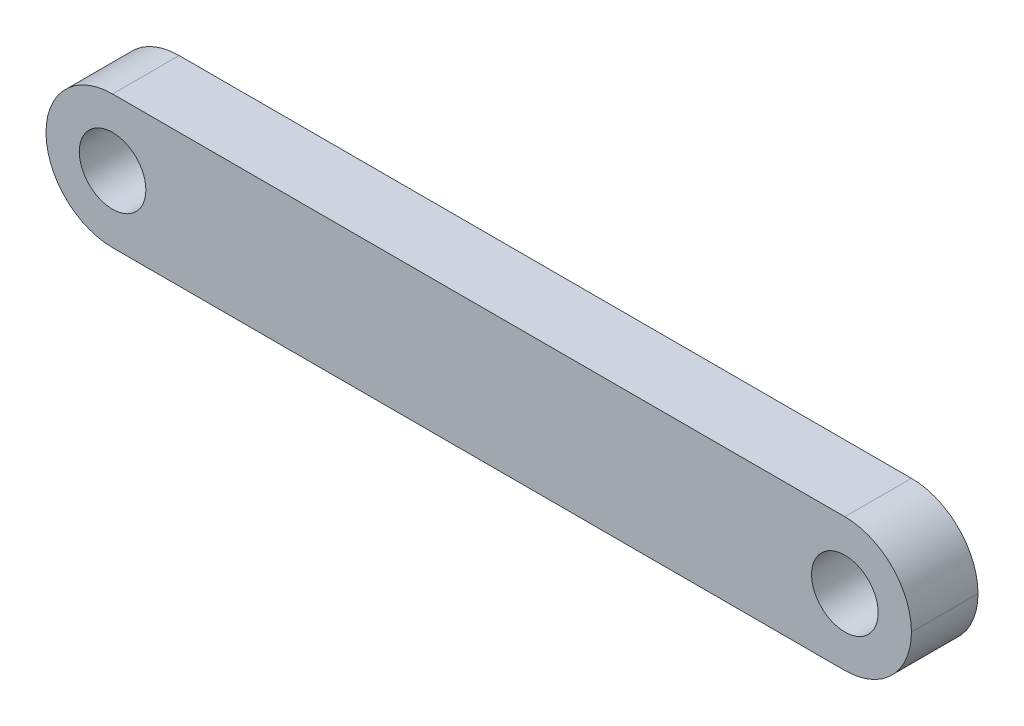
ISO-10303-21;
HEADER;
FILE_DESCRIPTION(('STEP AP214'),'2;1');
FILE_NAME('part.step','',(''),(''),'','','');
FILE_SCHEMA(('AUTOMOTIVE_DESIGN { 1 0 10303 214 1 1 1 1 }'));
ENDSEC;
DATA;
#1=APPLICATION_CONTEXT('core data for automotive mechanical design processes');
#2=APPLICATION_PROTOCOL_DEFINITION('international standard','automotive_design',2000,#1);
#3=PRODUCT_CONTEXT('',#1,'mechanical');
#4=PRODUCT('Part','Part','',(#3));
#5=PRODUCT_RELATED_PRODUCT_CATEGORY('part','',(#4));
#6=PRODUCT_DEFINITION_FORMATION('','',#4);
#7=PRODUCT_DEFINITION_CONTEXT('part definition',#1,'design');
#8=PRODUCT_DEFINITION('design','',#6,#7);
#9=PRODUCT_DEFINITION_SHAPE('','',#8);
#10=(LENGTH_UNIT() NAMED_UNIT(*) SI_UNIT(.MILLI.,.METRE.));
#11=(NAMED_UNIT(*) PLANE_ANGLE_UNIT() SI_UNIT($,.RADIAN.));
#12=(NAMED_UNIT(*) SI_UNIT($,.STERADIAN.) SOLID_ANGLE_UNIT());
#13=UNCERTAINTY_MEASURE_WITH_UNIT(LENGTH_MEASURE(1.E-05),#10,'distance_accuracy_value','');
#14=(GEOMETRIC_REPRESENTATION_CONTEXT(3) GLOBAL_UNCERTAINTY_ASSIGNED_CONTEXT((#13)) GLOBAL_UNIT_ASSIGNED_CONTEXT((#10,
#11,#12)) REPRESENTATION_CONTEXT('',''));
#15=CARTESIAN_POINT('',(0.,0.,0.));
#16=DIRECTION('',(0.,0.,1.));
#17=DIRECTION('',(1.,0.,0.));
#18=AXIS2_PLACEMENT_3D('',#15,#16,#17);
#19=CARTESIAN_POINT('',(0.,0.,6.35));
#20=DIRECTION('',(0.,1.,0.));
#21=DIRECTION('',(0.,0.,1.));
#22=AXIS2_PLACEMENT_3D('',#19,#20,#21);
#23=PLANE('',#22);
#24=DIRECTION('',(1.,0.,0.));
#25=VECTOR('',#24,1.);
#26=CARTESIAN_POINT('',(0.,0.,6.35));
#27=LINE('',#26,#25);
#28=CARTESIAN_POINT('',(6.35,0.,6.35));
#29=VERTEX_POINT('',#28);
#30=CARTESIAN_POINT('',(76.2,0.,6.35));
#31=VERTEX_POINT('',#30);
#32=EDGE_CURVE('E119',#29,#31,#27,.T.);
#33=ORIENTED_EDGE('',*,*,#32,.F.);
#34=DIRECTION('',(0.,0.,-1.));
#35=VECTOR('',#34,1.);
#36=CARTESIAN_POINT('',(6.35,0.,6.35));
#37=LINE('',#36,#35);
#38=CARTESIAN_POINT('',(6.35,0.,0.));
#39=VERTEX_POINT('',#38);
#40=EDGE_CURVE('E155',#29,#39,#37,.T.);
#41=ORIENTED_EDGE('',*,*,#40,.T.);
#42=DIRECTION('',(1.,0.,0.));
#43=VECTOR('',#42,1.);
#44=CARTESIAN_POINT('',(0.,0.,0.));
#45=LINE('',#44,#43);
#46=CARTESIAN_POINT('',(76.2,0.,0.));
#47=VERTEX_POINT('',#46);
#48=EDGE_CURVE('E120',#39,#47,#45,.T.);
#49=ORIENTED_EDGE('',*,*,#48,.T.);
#50=DIRECTION('',(0.,0.,-1.));
#51=VECTOR('',#50,1.);
#52=CARTESIAN_POINT('',(76.2,0.,6.35));
#53=LINE('',#52,#51);
#54=EDGE_CURVE('E137',#47,#31,#53,.F.);
#55=ORIENTED_EDGE('',*,*,#54,.T.);
#56=EDGE_LOOP('',(#33,#41,#49,#55));
#57=FACE_BOUND('',#56,.T.);
#58=ADVANCED_FACE('F39',(#57),#23,.F.);
#59=CARTESIAN_POINT('',(0.,12.7,6.35));
#60=DIRECTION('',(0.,-1.,0.));
#61=DIRECTION('',(1.,0.,0.));
#62=AXIS2_PLACEMENT_3D('',#59,#60,#61);
#63=PLANE('',#62);
#64=DIRECTION('',(-1.,0.,0.));
#65=VECTOR('',#64,1.);
#66=CARTESIAN_POINT('',(0.,12.7,0.));
#67=LINE('',#66,#65);
#68=CARTESIAN_POINT('',(76.2,12.7,0.));
#69=VERTEX_POINT('',#68);
#70=CARTESIAN_POINT('',(6.35,12.7,0.));
#71=VERTEX_POINT('',#70);
#72=EDGE_CURVE('E108',#69,#71,#67,.T.);
#73=ORIENTED_EDGE('',*,*,#72,.T.);
#74=DIRECTION('',(0.,0.,-1.));
#75=VECTOR('',#74,1.);
#76=CARTESIAN_POINT('',(6.35,12.7,6.35));
#77=LINE('',#76,#75);
#78=CARTESIAN_POINT('',(6.35,12.7,6.35));
#79=VERTEX_POINT('',#78);
#80=EDGE_CURVE('E149',#71,#79,#77,.F.);
#81=ORIENTED_EDGE('',*,*,#80,.T.);
#82=DIRECTION('',(-1.,0.,0.));
#83=VECTOR('',#82,1.);
#84=CARTESIAN_POINT('',(0.,12.7,6.35));
#85=LINE('',#84,#83);
#86=CARTESIAN_POINT('',(76.2,12.7,6.35));
#87=VERTEX_POINT('',#86);
#88=EDGE_CURVE('E111',#87,#79,#85,.T.);
#89=ORIENTED_EDGE('',*,*,#88,.F.);
#90=DIRECTION('',(0.,0.,-1.));
#91=VECTOR('',#90,1.);
#92=CARTESIAN_POINT('',(76.2,12.7,6.35));
#93=LINE('',#92,#91);
#94=EDGE_CURVE('E96',#87,#69,#93,.T.);
#95=ORIENTED_EDGE('',*,*,#94,.T.);
#96=EDGE_LOOP('',(#73,#81,#89,#95));
#97=FACE_BOUND('',#96,.T.);
#98=ADVANCED_FACE('F107',(#97),#63,.F.);
#99=CARTESIAN_POINT('',(0.,0.,6.35));
#100=DIRECTION('',(0.,0.,1.));
#101=DIRECTION('',(1.,0.,0.));
#102=AXIS2_PLACEMENT_3D('',#99,#100,#101);
#103=PLANE('',#102);
#104=CARTESIAN_POINT('',(6.35,6.35,6.35));
#105=DIRECTION('',(0.,0.,1.));
#106=DIRECTION('',(1.,0.,0.));
#107=AXIS2_PLACEMENT_3D('',#104,#105,#106);
#108=CIRCLE('',#107,3.175);
#109=CARTESIAN_POINT('',(9.525,6.35,6.35));
#110=VERTEX_POINT('',#109);
#111=EDGE_CURVE('E202',#110,#110,#108,.T.);
#112=ORIENTED_EDGE('',*,*,#111,.F.);
#113=EDGE_LOOP('',(#112));
#114=FACE_BOUND('',#113,.T.);
#115=CARTESIAN_POINT('',(76.2,6.35,6.35));
#116=DIRECTION('',(0.,0.,1.));
#117=DIRECTION('',(1.,0.,0.));
#118=AXIS2_PLACEMENT_3D('',#115,#116,#117);
#119=CIRCLE('',#118,3.175);
#120=CARTESIAN_POINT('',(79.375,6.35,6.35));
#121=VERTEX_POINT('',#120);
#122=EDGE_CURVE('E210',#121,#121,#119,.T.);
#123=ORIENTED_EDGE('',*,*,#122,.F.);
#124=EDGE_LOOP('',(#123));
#125=FACE_BOUND('',#124,.T.);
#126=CARTESIAN_POINT('',(6.35,6.35,6.35));
#127=DIRECTION('',(0.,0.,1.));
#128=DIRECTION('',(1.,0.,0.));
#129=AXIS2_PLACEMENT_3D('',#126,#127,#128);
#130=CIRCLE('',#129,6.35);
#131=CARTESIAN_POINT('',(0.,6.35,6.35));
#132=VERTEX_POINT('',#131);
#133=EDGE_CURVE('E152',#79,#132,#130,.T.);
#134=ORIENTED_EDGE('',*,*,#133,.T.);
#135=CARTESIAN_POINT('',(6.35,6.35,6.35));
#136=DIRECTION('',(0.,0.,1.));
#137=DIRECTION('',(1.,0.,0.));
#138=AXIS2_PLACEMENT_3D('',#135,#136,#137);
#139=CIRCLE('',#138,6.35);
#140=EDGE_CURVE('E11',#132,#29,#139,.T.);
#141=ORIENTED_EDGE('',*,*,#140,.T.);
#142=ORIENTED_EDGE('',*,*,#32,.T.);
#143=CARTESIAN_POINT('',(76.2,6.35,6.35));
#144=DIRECTION('',(0.,0.,1.));
#145=DIRECTION('',(1.,0.,0.));
#146=AXIS2_PLACEMENT_3D('',#143,#144,#145);
#147=CIRCLE('',#146,6.35);
#148=CARTESIAN_POINT('',(82.55,6.35,6.35));
#149=VERTEX_POINT('',#148);
#150=EDGE_CURVE('E141',#31,#149,#147,.T.);
#151=ORIENTED_EDGE('',*,*,#150,.T.);
#152=CARTESIAN_POINT('',(76.2,6.35,6.35));
#153=DIRECTION('',(0.,0.,1.));
#154=DIRECTION('',(1.,0.,0.));
#155=AXIS2_PLACEMENT_3D('',#152,#153,#154);
#156=CIRCLE('',#155,6.35);
#157=EDGE_CURVE('E131',#149,#87,#156,.T.);
#158=ORIENTED_EDGE('',*,*,#157,.T.);
#159=ORIENTED_EDGE('',*,*,#88,.T.);
#160=EDGE_LOOP('',(#134,#141,#142,#151,#158,#159));
#161=FACE_BOUND('',#160,.T.);
#162=ADVANCED_FACE('F165',(#114,#125,#161),#103,.T.);
#163=CARTESIAN_POINT('',(0.,0.,0.));
#164=DIRECTION('',(0.,0.,1.));
#165=DIRECTION('',(1.,0.,0.));
#166=AXIS2_PLACEMENT_3D('',#163,#164,#165);
#167=PLANE('',#166);
#168=CARTESIAN_POINT('',(6.35,6.35,0.));
#169=DIRECTION('',(0.,0.,1.));
#170=DIRECTION('',(1.,0.,0.));
#171=AXIS2_PLACEMENT_3D('',#168,#169,#170);
#172=CIRCLE('',#171,3.175);
#173=CARTESIAN_POINT('',(9.525,6.35,0.));
#174=VERTEX_POINT('',#173);
#175=EDGE_CURVE('E125',#174,#174,#172,.T.);
#176=ORIENTED_EDGE('',*,*,#175,.T.);
#177=EDGE_LOOP('',(#176));
#178=FACE_BOUND('',#177,.T.);
#179=CARTESIAN_POINT('',(76.2,6.35,0.));
#180=DIRECTION('',(0.,0.,1.));
#181=DIRECTION('',(1.,0.,0.));
#182=AXIS2_PLACEMENT_3D('',#179,#180,#181);
#183=CIRCLE('',#182,3.175);
#184=CARTESIAN_POINT('',(79.375,6.35,0.));
#185=VERTEX_POINT('',#184);
#186=EDGE_CURVE('E204',#185,#185,#183,.T.);
#187=ORIENTED_EDGE('',*,*,#186,.T.);
#188=EDGE_LOOP('',(#187));
#189=FACE_BOUND('',#188,.T.);
#190=ORIENTED_EDGE('',*,*,#48,.F.);
#191=CARTESIAN_POINT('',(6.35,6.35,0.));
#192=DIRECTION('',(0.,0.,1.));
#193=DIRECTION('',(1.,0.,0.));
#194=AXIS2_PLACEMENT_3D('',#191,#192,#193);
#195=CIRCLE('',#194,6.35);
#196=CARTESIAN_POINT('',(0.,6.35,0.));
#197=VERTEX_POINT('',#196);
#198=EDGE_CURVE('E48',#39,#197,#195,.F.);
#199=ORIENTED_EDGE('',*,*,#198,.T.);
#200=CARTESIAN_POINT('',(6.35,6.35,0.));
#201=DIRECTION('',(0.,0.,1.));
#202=DIRECTION('',(1.,0.,0.));
#203=AXIS2_PLACEMENT_3D('',#200,#201,#202);
#204=CIRCLE('',#203,6.35);
#205=EDGE_CURVE('E117',#197,#71,#204,.F.);
#206=ORIENTED_EDGE('',*,*,#205,.T.);
#207=ORIENTED_EDGE('',*,*,#72,.F.);
#208=CARTESIAN_POINT('',(76.2,6.35,0.));
#209=DIRECTION('',(0.,0.,1.));
#210=DIRECTION('',(1.,0.,0.));
#211=AXIS2_PLACEMENT_3D('',#208,#209,#210);
#212=CIRCLE('',#211,6.35);
#213=CARTESIAN_POINT('',(82.55,6.35,0.));
#214=VERTEX_POINT('',#213);
#215=EDGE_CURVE('E92',#69,#214,#212,.F.);
#216=ORIENTED_EDGE('',*,*,#215,.T.);
#217=CARTESIAN_POINT('',(76.2,6.35,0.));
#218=DIRECTION('',(0.,0.,1.));
#219=DIRECTION('',(1.,0.,0.));
#220=AXIS2_PLACEMENT_3D('',#217,#218,#219);
#221=CIRCLE('',#220,6.35);
#222=EDGE_CURVE('E134',#214,#47,#221,.F.);
#223=ORIENTED_EDGE('',*,*,#222,.T.);
#224=EDGE_LOOP('',(#190,#199,#206,#207,#216,#223));
#225=FACE_BOUND('',#224,.T.);
#226=ADVANCED_FACE('F115',(#178,#189,#225),#167,.F.);
#227=CARTESIAN_POINT('',(76.2,6.35,6.35));
#228=DIRECTION('',(0.,0.,-1.));
#229=DIRECTION('',(-1.,0.,0.));
#230=AXIS2_PLACEMENT_3D('',#227,#228,#229);
#231=CYLINDRICAL_SURFACE('',#230,6.35);
#232=ORIENTED_EDGE('',*,*,#157,.F.);
#233=DIRECTION('',(0.,0.,-1.));
#234=VECTOR('',#233,1.);
#235=CARTESIAN_POINT('',(82.55,6.35,6.35));
#236=LINE('',#235,#234);
#237=EDGE_CURVE('E98',#214,#149,#236,.F.);
#238=ORIENTED_EDGE('',*,*,#237,.F.);
#239=ORIENTED_EDGE('',*,*,#215,.F.);
#240=ORIENTED_EDGE('',*,*,#94,.F.);
#241=EDGE_LOOP('',(#232,#238,#239,#240));
#242=FACE_BOUND('',#241,.T.);
#243=ADVANCED_FACE('F95',(#242),#231,.T.);
#244=CARTESIAN_POINT('',(76.2,6.35,6.35));
#245=DIRECTION('',(0.,0.,-1.));
#246=DIRECTION('',(-1.,0.,0.));
#247=AXIS2_PLACEMENT_3D('',#244,#245,#246);
#248=CYLINDRICAL_SURFACE('',#247,6.35);
#249=ORIENTED_EDGE('',*,*,#150,.F.);
#250=ORIENTED_EDGE('',*,*,#54,.F.);
#251=ORIENTED_EDGE('',*,*,#222,.F.);
#252=ORIENTED_EDGE('',*,*,#237,.T.);
#253=EDGE_LOOP('',(#249,#250,#251,#252));
#254=FACE_BOUND('',#253,.T.);
#255=ADVANCED_FACE('F167',(#254),#248,.T.);
#256=CARTESIAN_POINT('',(6.35,6.35,6.35));
#257=DIRECTION('',(0.,0.,-1.));
#258=DIRECTION('',(-1.,0.,0.));
#259=AXIS2_PLACEMENT_3D('',#256,#257,#258);
#260=CYLINDRICAL_SURFACE('',#259,6.35);
#261=ORIENTED_EDGE('',*,*,#133,.F.);
#262=ORIENTED_EDGE('',*,*,#80,.F.);
#263=ORIENTED_EDGE('',*,*,#205,.F.);
#264=DIRECTION('',(0.,0.,-1.));
#265=VECTOR('',#264,1.);
#266=CARTESIAN_POINT('',(0.,6.35,6.35));
#267=LINE('',#266,#265);
#268=EDGE_CURVE('E144',#132,#197,#267,.T.);
#269=ORIENTED_EDGE('',*,*,#268,.F.);
#270=EDGE_LOOP('',(#261,#262,#263,#269));
#271=FACE_BOUND('',#270,.T.);
#272=ADVANCED_FACE('F161',(#271),#260,.T.);
#273=CARTESIAN_POINT('',(6.35,6.35,6.35));
#274=DIRECTION('',(0.,0.,-1.));
#275=DIRECTION('',(-1.,0.,0.));
#276=AXIS2_PLACEMENT_3D('',#273,#274,#275);
#277=CYLINDRICAL_SURFACE('',#276,6.35);
#278=ORIENTED_EDGE('',*,*,#140,.F.);
#279=ORIENTED_EDGE('',*,*,#268,.T.);
#280=ORIENTED_EDGE('',*,*,#198,.F.);
#281=ORIENTED_EDGE('',*,*,#40,.F.);
#282=EDGE_LOOP('',(#278,#279,#280,#281));
#283=FACE_BOUND('',#282,.T.);
#284=ADVANCED_FACE('F41',(#283),#277,.T.);
#285=CARTESIAN_POINT('',(76.2,6.35,0.));
#286=DIRECTION('',(0.,0.,1.));
#287=DIRECTION('',(1.,0.,0.));
#288=AXIS2_PLACEMENT_3D('',#285,#286,#287);
#289=CYLINDRICAL_SURFACE('',#288,3.175);
#290=ORIENTED_EDGE('',*,*,#186,.F.);
#291=EDGE_LOOP('',(#290));
#292=FACE_BOUND('',#291,.T.);
#293=ORIENTED_EDGE('',*,*,#122,.T.);
#294=EDGE_LOOP('',(#293));
#295=FACE_BOUND('',#294,.T.);
#296=ADVANCED_FACE('F188',(#292,#295),#289,.F.);
#297=CARTESIAN_POINT('',(6.35,6.35,0.));
#298=DIRECTION('',(0.,0.,1.));
#299=DIRECTION('',(1.,0.,0.));
#300=AXIS2_PLACEMENT_3D('',#297,#298,#299);
#301=CYLINDRICAL_SURFACE('',#300,3.175);
#302=ORIENTED_EDGE('',*,*,#175,.F.);
#303=EDGE_LOOP('',(#302));
#304=FACE_BOUND('',#303,.T.);
#305=ORIENTED_EDGE('',*,*,#111,.T.);
#306=EDGE_LOOP('',(#305));
#307=FACE_BOUND('',#306,.T.);
#308=ADVANCED_FACE('F191',(#304,#307),#301,.F.);
#309=CLOSED_SHELL('',(#58,#98,#162,#226,#243,#255,#272,#284,#296,#308));
#310=MANIFOLD_SOLID_BREP('B2',#309);
#311=ADVANCED_BREP_SHAPE_REPRESENTATION('',(#18,#310),#14);
#312=SHAPE_DEFINITION_REPRESENTATION(#9,#311);
ENDSEC;
END-ISO-10303-21;
